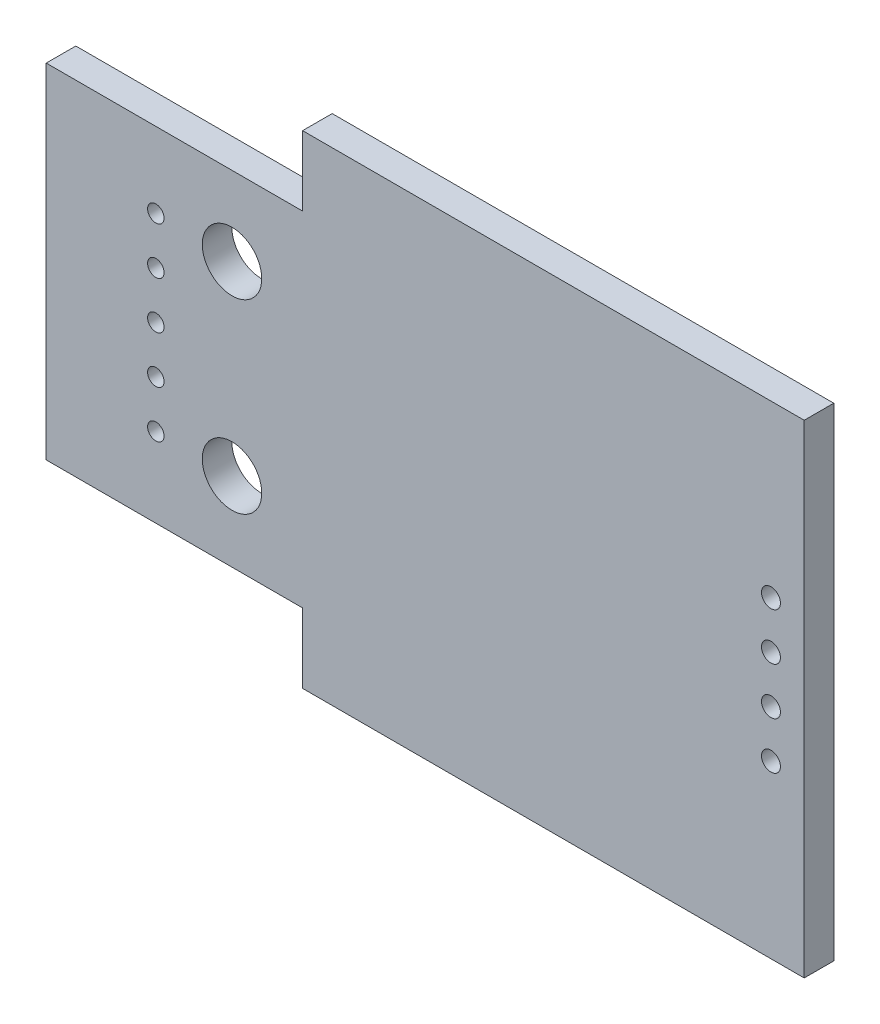
ISO-10303-21;
HEADER;
FILE_DESCRIPTION(('STEP AP214'),'2;1');
FILE_NAME('part.step','',(''),(''),'','','');
FILE_SCHEMA(('AUTOMOTIVE_DESIGN { 1 0 10303 214 1 1 1 1 }'));
ENDSEC;
DATA;
#1=APPLICATION_CONTEXT('core data for automotive mechanical design processes');
#2=APPLICATION_PROTOCOL_DEFINITION('international standard','automotive_design',2000,#1);
#3=PRODUCT_CONTEXT('',#1,'mechanical');
#4=PRODUCT('Part','Part','',(#3));
#5=PRODUCT_RELATED_PRODUCT_CATEGORY('part','',(#4));
#6=PRODUCT_DEFINITION_FORMATION('','',#4);
#7=PRODUCT_DEFINITION_CONTEXT('part definition',#1,'design');
#8=PRODUCT_DEFINITION('design','',#6,#7);
#9=PRODUCT_DEFINITION_SHAPE('','',#8);
#10=(LENGTH_UNIT() NAMED_UNIT(*) SI_UNIT(.MILLI.,.METRE.));
#11=(NAMED_UNIT(*) PLANE_ANGLE_UNIT() SI_UNIT($,.RADIAN.));
#12=(NAMED_UNIT(*) SI_UNIT($,.STERADIAN.) SOLID_ANGLE_UNIT());
#13=UNCERTAINTY_MEASURE_WITH_UNIT(LENGTH_MEASURE(1.E-05),#10,'distance_accuracy_value','');
#14=(GEOMETRIC_REPRESENTATION_CONTEXT(3) GLOBAL_UNCERTAINTY_ASSIGNED_CONTEXT((#13)) GLOBAL_UNIT_ASSIGNED_CONTEXT((#10,
#11,#12)) REPRESENTATION_CONTEXT('',''));
#15=CARTESIAN_POINT('',(0.,0.,0.));
#16=DIRECTION('',(0.,0.,1.));
#17=DIRECTION('',(1.,0.,0.));
#18=AXIS2_PLACEMENT_3D('',#15,#16,#17);
#19=CARTESIAN_POINT('',(9.199999809265,4.75,1.59143954));
#20=DIRECTION('',(0.,0.,1.));
#21=DIRECTION('',(1.,0.,0.));
#22=AXIS2_PLACEMENT_3D('',#19,#20,#21);
#23=PLANE('',#22);
#24=CARTESIAN_POINT('',(48.20984008,17.83400294,1.59143954));
#25=DIRECTION('',(0.,0.,1.));
#26=DIRECTION('',(1.,0.,0.));
#27=AXIS2_PLACEMENT_3D('',#24,#25,#26);
#28=CIRCLE('',#27,0.50999898);
#29=CARTESIAN_POINT('',(48.71983906,17.83400294,1.59143954));
#30=VERTEX_POINT('',#29);
#31=EDGE_CURVE('E27',#30,#30,#28,.T.);
#32=ORIENTED_EDGE('',*,*,#31,.F.);
#33=EDGE_LOOP('',(#32));
#34=FACE_BOUND('',#33,.T.);
#35=CARTESIAN_POINT('',(48.20984008,15.29400294,1.59143954));
#36=DIRECTION('',(0.,0.,1.));
#37=DIRECTION('',(1.,0.,0.));
#38=AXIS2_PLACEMENT_3D('',#35,#36,#37);
#39=CIRCLE('',#38,0.50999898);
#40=CARTESIAN_POINT('',(48.71983906,15.29400294,1.59143954));
#41=VERTEX_POINT('',#40);
#42=EDGE_CURVE('E275',#41,#41,#39,.T.);
#43=ORIENTED_EDGE('',*,*,#42,.F.);
#44=EDGE_LOOP('',(#43));
#45=FACE_BOUND('',#44,.T.);
#46=CARTESIAN_POINT('',(19.1999997,19.0000001,1.59143954));
#47=DIRECTION('',(0.,0.,1.));
#48=DIRECTION('',(1.,0.,0.));
#49=AXIS2_PLACEMENT_3D('',#46,#47,#48);
#50=CIRCLE('',#49,1.59999934);
#51=CARTESIAN_POINT('',(20.79999904,19.0000001,1.59143954));
#52=VERTEX_POINT('',#51);
#53=EDGE_CURVE('E240',#52,#52,#50,.T.);
#54=ORIENTED_EDGE('',*,*,#53,.F.);
#55=EDGE_LOOP('',(#54));
#56=FACE_BOUND('',#55,.T.);
#57=CARTESIAN_POINT('',(48.20984008,12.75400294,1.59143954));
#58=DIRECTION('',(0.,0.,1.));
#59=DIRECTION('',(1.,0.,0.));
#60=AXIS2_PLACEMENT_3D('',#57,#58,#59);
#61=CIRCLE('',#60,0.50999898);
#62=CARTESIAN_POINT('',(48.71983906,12.75400294,1.59143954));
#63=VERTEX_POINT('',#62);
#64=EDGE_CURVE('E271',#63,#63,#61,.T.);
#65=ORIENTED_EDGE('',*,*,#64,.F.);
#66=EDGE_LOOP('',(#65));
#67=FACE_BOUND('',#66,.T.);
#68=CARTESIAN_POINT('',(48.20984008,10.21400294,1.59143954));
#69=DIRECTION('',(0.,0.,1.));
#70=DIRECTION('',(1.,0.,0.));
#71=AXIS2_PLACEMENT_3D('',#68,#69,#70);
#72=CIRCLE('',#71,0.50999898);
#73=CARTESIAN_POINT('',(48.71983906,10.21400294,1.59143954));
#74=VERTEX_POINT('',#73);
#75=EDGE_CURVE('E303',#74,#74,#72,.T.);
#76=ORIENTED_EDGE('',*,*,#75,.F.);
#77=EDGE_LOOP('',(#76));
#78=FACE_BOUND('',#77,.T.);
#79=CARTESIAN_POINT('',(19.1999997,8.99999978,1.59143954));
#80=DIRECTION('',(0.,0.,1.));
#81=DIRECTION('',(1.,0.,0.));
#82=AXIS2_PLACEMENT_3D('',#79,#80,#81);
#83=CIRCLE('',#82,1.59999934);
#84=CARTESIAN_POINT('',(20.79999904,8.99999978,1.59143954));
#85=VERTEX_POINT('',#84);
#86=EDGE_CURVE('E264',#85,#85,#83,.T.);
#87=ORIENTED_EDGE('',*,*,#86,.F.);
#88=EDGE_LOOP('',(#87));
#89=FACE_BOUND('',#88,.T.);
#90=CARTESIAN_POINT('',(15.10000028,16.64999972,1.59143954));
#91=DIRECTION('',(0.,0.,1.));
#92=DIRECTION('',(1.,0.,0.));
#93=AXIS2_PLACEMENT_3D('',#90,#91,#92);
#94=CIRCLE('',#93,0.4445);
#95=CARTESIAN_POINT('',(15.54450028,16.64999972,1.59143954));
#96=VERTEX_POINT('',#95);
#97=EDGE_CURVE('E236',#96,#96,#94,.T.);
#98=ORIENTED_EDGE('',*,*,#97,.F.);
#99=EDGE_LOOP('',(#98));
#100=FACE_BOUND('',#99,.T.);
#101=CARTESIAN_POINT('',(15.10000028,14.10999972,1.59143954));
#102=DIRECTION('',(0.,0.,1.));
#103=DIRECTION('',(1.,0.,0.));
#104=AXIS2_PLACEMENT_3D('',#101,#102,#103);
#105=CIRCLE('',#104,0.4445);
#106=CARTESIAN_POINT('',(15.54450028,14.10999972,1.59143954));
#107=VERTEX_POINT('',#106);
#108=EDGE_CURVE('E347',#107,#107,#105,.T.);
#109=ORIENTED_EDGE('',*,*,#108,.F.);
#110=EDGE_LOOP('',(#109));
#111=FACE_BOUND('',#110,.T.);
#112=CARTESIAN_POINT('',(15.10000028,19.18999972,1.59143954));
#113=DIRECTION('',(0.,0.,1.));
#114=DIRECTION('',(1.,0.,0.));
#115=AXIS2_PLACEMENT_3D('',#112,#113,#114);
#116=CIRCLE('',#115,0.4445);
#117=CARTESIAN_POINT('',(15.54450028,19.18999972,1.59143954));
#118=VERTEX_POINT('',#117);
#119=EDGE_CURVE('E410',#118,#118,#116,.T.);
#120=ORIENTED_EDGE('',*,*,#119,.F.);
#121=EDGE_LOOP('',(#120));
#122=FACE_BOUND('',#121,.T.);
#123=CARTESIAN_POINT('',(15.10000028,9.02999972,1.59143954));
#124=DIRECTION('',(0.,0.,1.));
#125=DIRECTION('',(1.,0.,0.));
#126=AXIS2_PLACEMENT_3D('',#123,#124,#125);
#127=CIRCLE('',#126,0.4445);
#128=CARTESIAN_POINT('',(15.54450028,9.02999972,1.59143954));
#129=VERTEX_POINT('',#128);
#130=EDGE_CURVE('E280',#129,#129,#127,.T.);
#131=ORIENTED_EDGE('',*,*,#130,.F.);
#132=EDGE_LOOP('',(#131));
#133=FACE_BOUND('',#132,.T.);
#134=CARTESIAN_POINT('',(15.10000028,11.56999972,1.59143954));
#135=DIRECTION('',(0.,0.,1.));
#136=DIRECTION('',(1.,0.,0.));
#137=AXIS2_PLACEMENT_3D('',#134,#135,#136);
#138=CIRCLE('',#137,0.4445);
#139=CARTESIAN_POINT('',(15.54450028,11.56999972,1.59143954));
#140=VERTEX_POINT('',#139);
#141=EDGE_CURVE('E282',#140,#140,#138,.T.);
#142=ORIENTED_EDGE('',*,*,#141,.F.);
#143=EDGE_LOOP('',(#142));
#144=FACE_BOUND('',#143,.T.);
#145=DIRECTION('',(-1.,0.,0.));
#146=VECTOR('',#145,1.);
#147=CARTESIAN_POINT('',(23.,4.75,1.59143954));
#148=LINE('',#147,#146);
#149=CARTESIAN_POINT('',(23.,4.75,1.59143954));
#150=VERTEX_POINT('',#149);
#151=CARTESIAN_POINT('',(9.199999809265,4.75,1.59143954));
#152=VERTEX_POINT('',#151);
#153=EDGE_CURVE('E108',#150,#152,#148,.T.);
#154=ORIENTED_EDGE('',*,*,#153,.F.);
#155=DIRECTION('',(0.,1.,0.));
#156=VECTOR('',#155,1.);
#157=CARTESIAN_POINT('',(23.,1.,1.59143954));
#158=LINE('',#157,#156);
#159=CARTESIAN_POINT('',(23.,1.,1.59143954));
#160=VERTEX_POINT('',#159);
#161=EDGE_CURVE('E198',#160,#150,#158,.T.);
#162=ORIENTED_EDGE('',*,*,#161,.F.);
#163=DIRECTION('',(-1.,0.,0.));
#164=VECTOR('',#163,1.);
#165=CARTESIAN_POINT('',(50.,1.,1.59143954));
#166=LINE('',#165,#164);
#167=CARTESIAN_POINT('',(50.,1.,1.59143954));
#168=VERTEX_POINT('',#167);
#169=EDGE_CURVE('E191',#168,#160,#166,.T.);
#170=ORIENTED_EDGE('',*,*,#169,.F.);
#171=DIRECTION('',(0.,-1.,0.));
#172=VECTOR('',#171,1.);
#173=CARTESIAN_POINT('',(50.,27.,1.59143954));
#174=LINE('',#173,#172);
#175=CARTESIAN_POINT('',(50.,27.,1.59143954));
#176=VERTEX_POINT('',#175);
#177=EDGE_CURVE('E195',#176,#168,#174,.T.);
#178=ORIENTED_EDGE('',*,*,#177,.F.);
#179=DIRECTION('',(1.,0.,0.));
#180=VECTOR('',#179,1.);
#181=CARTESIAN_POINT('',(23.,27.,1.59143954));
#182=LINE('',#181,#180);
#183=CARTESIAN_POINT('',(23.,27.,1.59143954));
#184=VERTEX_POINT('',#183);
#185=EDGE_CURVE('E259',#184,#176,#182,.T.);
#186=ORIENTED_EDGE('',*,*,#185,.F.);
#187=DIRECTION('',(0.,1.,0.));
#188=VECTOR('',#187,1.);
#189=CARTESIAN_POINT('',(23.,23.25,1.59143954));
#190=LINE('',#189,#188);
#191=CARTESIAN_POINT('',(23.,23.25,1.59143954));
#192=VERTEX_POINT('',#191);
#193=EDGE_CURVE('E289',#192,#184,#190,.T.);
#194=ORIENTED_EDGE('',*,*,#193,.F.);
#195=DIRECTION('',(1.,0.,0.));
#196=VECTOR('',#195,1.);
#197=CARTESIAN_POINT('',(9.199999809265,23.25,1.59143954));
#198=LINE('',#197,#196);
#199=CARTESIAN_POINT('',(9.199999809265,23.25,1.59143954));
#200=VERTEX_POINT('',#199);
#201=EDGE_CURVE('E359',#200,#192,#198,.T.);
#202=ORIENTED_EDGE('',*,*,#201,.F.);
#203=DIRECTION('',(0.,1.,0.));
#204=VECTOR('',#203,1.);
#205=CARTESIAN_POINT('',(9.199999809265,4.75,1.59143954));
#206=LINE('',#205,#204);
#207=EDGE_CURVE('E252',#152,#200,#206,.T.);
#208=ORIENTED_EDGE('',*,*,#207,.F.);
#209=EDGE_LOOP('',(#154,#162,#170,#178,#186,#194,#202,#208));
#210=FACE_BOUND('',#209,.T.);
#211=ADVANCED_FACE('F16',(#34,#45,#56,#67,#78,#89,#100,#111,#122,#133,#144,#210),#23,.T.);
#212=CARTESIAN_POINT('',(9.199999809265,4.75,0.));
#213=DIRECTION('',(0.,0.,1.));
#214=DIRECTION('',(1.,0.,0.));
#215=AXIS2_PLACEMENT_3D('',#212,#213,#214);
#216=PLANE('',#215);
#217=CARTESIAN_POINT('',(48.20984008,17.83400294,0.));
#218=DIRECTION('',(0.,0.,1.));
#219=DIRECTION('',(1.,0.,0.));
#220=AXIS2_PLACEMENT_3D('',#217,#218,#219);
#221=CIRCLE('',#220,0.50999898);
#222=CARTESIAN_POINT('',(48.71983906,17.83400294,0.));
#223=VERTEX_POINT('',#222);
#224=EDGE_CURVE('E11',#223,#223,#221,.T.);
#225=ORIENTED_EDGE('',*,*,#224,.T.);
#226=EDGE_LOOP('',(#225));
#227=FACE_BOUND('',#226,.T.);
#228=CARTESIAN_POINT('',(48.20984008,15.29400294,0.));
#229=DIRECTION('',(0.,0.,1.));
#230=DIRECTION('',(1.,0.,0.));
#231=AXIS2_PLACEMENT_3D('',#228,#229,#230);
#232=CIRCLE('',#231,0.50999898);
#233=CARTESIAN_POINT('',(48.71983906,15.29400294,0.));
#234=VERTEX_POINT('',#233);
#235=EDGE_CURVE('E311',#234,#234,#232,.T.);
#236=ORIENTED_EDGE('',*,*,#235,.T.);
#237=EDGE_LOOP('',(#236));
#238=FACE_BOUND('',#237,.T.);
#239=CARTESIAN_POINT('',(19.1999997,19.0000001,0.));
#240=DIRECTION('',(0.,0.,1.));
#241=DIRECTION('',(1.,0.,0.));
#242=AXIS2_PLACEMENT_3D('',#239,#240,#241);
#243=CIRCLE('',#242,1.59999934);
#244=CARTESIAN_POINT('',(20.79999904,19.0000001,0.));
#245=VERTEX_POINT('',#244);
#246=EDGE_CURVE('E243',#245,#245,#243,.T.);
#247=ORIENTED_EDGE('',*,*,#246,.T.);
#248=EDGE_LOOP('',(#247));
#249=FACE_BOUND('',#248,.T.);
#250=CARTESIAN_POINT('',(48.20984008,12.75400294,0.));
#251=DIRECTION('',(0.,0.,1.));
#252=DIRECTION('',(1.,0.,0.));
#253=AXIS2_PLACEMENT_3D('',#250,#251,#252);
#254=CIRCLE('',#253,0.50999898);
#255=CARTESIAN_POINT('',(48.71983906,12.75400294,0.));
#256=VERTEX_POINT('',#255);
#257=EDGE_CURVE('E268',#256,#256,#254,.T.);
#258=ORIENTED_EDGE('',*,*,#257,.T.);
#259=EDGE_LOOP('',(#258));
#260=FACE_BOUND('',#259,.T.);
#261=CARTESIAN_POINT('',(48.20984008,10.21400294,0.));
#262=DIRECTION('',(0.,0.,1.));
#263=DIRECTION('',(1.,0.,0.));
#264=AXIS2_PLACEMENT_3D('',#261,#262,#263);
#265=CIRCLE('',#264,0.50999898);
#266=CARTESIAN_POINT('',(48.71983906,10.21400294,0.));
#267=VERTEX_POINT('',#266);
#268=EDGE_CURVE('E343',#267,#267,#265,.T.);
#269=ORIENTED_EDGE('',*,*,#268,.T.);
#270=EDGE_LOOP('',(#269));
#271=FACE_BOUND('',#270,.T.);
#272=CARTESIAN_POINT('',(19.1999997,8.99999978,0.));
#273=DIRECTION('',(0.,0.,1.));
#274=DIRECTION('',(1.,0.,0.));
#275=AXIS2_PLACEMENT_3D('',#272,#273,#274);
#276=CIRCLE('',#275,1.59999934);
#277=CARTESIAN_POINT('',(20.79999904,8.99999978,0.));
#278=VERTEX_POINT('',#277);
#279=EDGE_CURVE('E267',#278,#278,#276,.T.);
#280=ORIENTED_EDGE('',*,*,#279,.T.);
#281=EDGE_LOOP('',(#280));
#282=FACE_BOUND('',#281,.T.);
#283=CARTESIAN_POINT('',(15.10000028,16.64999972,0.));
#284=DIRECTION('',(0.,0.,1.));
#285=DIRECTION('',(1.,0.,0.));
#286=AXIS2_PLACEMENT_3D('',#283,#284,#285);
#287=CIRCLE('',#286,0.4445);
#288=CARTESIAN_POINT('',(15.54450028,16.64999972,0.));
#289=VERTEX_POINT('',#288);
#290=EDGE_CURVE('E232',#289,#289,#287,.T.);
#291=ORIENTED_EDGE('',*,*,#290,.T.);
#292=EDGE_LOOP('',(#291));
#293=FACE_BOUND('',#292,.T.);
#294=CARTESIAN_POINT('',(15.10000028,14.10999972,0.));
#295=DIRECTION('',(0.,0.,1.));
#296=DIRECTION('',(1.,0.,0.));
#297=AXIS2_PLACEMENT_3D('',#294,#295,#296);
#298=CIRCLE('',#297,0.4445);
#299=CARTESIAN_POINT('',(15.54450028,14.10999972,0.));
#300=VERTEX_POINT('',#299);
#301=EDGE_CURVE('E344',#300,#300,#298,.T.);
#302=ORIENTED_EDGE('',*,*,#301,.T.);
#303=EDGE_LOOP('',(#302));
#304=FACE_BOUND('',#303,.T.);
#305=CARTESIAN_POINT('',(15.10000028,19.18999972,0.));
#306=DIRECTION('',(0.,0.,1.));
#307=DIRECTION('',(1.,0.,0.));
#308=AXIS2_PLACEMENT_3D('',#305,#306,#307);
#309=CIRCLE('',#308,0.4445);
#310=CARTESIAN_POINT('',(15.54450028,19.18999972,0.));
#311=VERTEX_POINT('',#310);
#312=EDGE_CURVE('E352',#311,#311,#309,.T.);
#313=ORIENTED_EDGE('',*,*,#312,.T.);
#314=EDGE_LOOP('',(#313));
#315=FACE_BOUND('',#314,.T.);
#316=CARTESIAN_POINT('',(15.10000028,9.02999972,0.));
#317=DIRECTION('',(0.,0.,1.));
#318=DIRECTION('',(1.,0.,0.));
#319=AXIS2_PLACEMENT_3D('',#316,#317,#318);
#320=CIRCLE('',#319,0.4445);
#321=CARTESIAN_POINT('',(15.54450028,9.02999972,0.));
#322=VERTEX_POINT('',#321);
#323=EDGE_CURVE('E319',#322,#322,#320,.T.);
#324=ORIENTED_EDGE('',*,*,#323,.T.);
#325=EDGE_LOOP('',(#324));
#326=FACE_BOUND('',#325,.T.);
#327=CARTESIAN_POINT('',(15.10000028,11.56999972,0.));
#328=DIRECTION('',(0.,0.,1.));
#329=DIRECTION('',(1.,0.,0.));
#330=AXIS2_PLACEMENT_3D('',#327,#328,#329);
#331=CIRCLE('',#330,0.4445);
#332=CARTESIAN_POINT('',(15.54450028,11.56999972,0.));
#333=VERTEX_POINT('',#332);
#334=EDGE_CURVE('E281',#333,#333,#331,.T.);
#335=ORIENTED_EDGE('',*,*,#334,.T.);
#336=EDGE_LOOP('',(#335));
#337=FACE_BOUND('',#336,.T.);
#338=DIRECTION('',(0.,1.,0.));
#339=VECTOR('',#338,1.);
#340=CARTESIAN_POINT('',(9.199999809265,4.75,0.));
#341=LINE('',#340,#339);
#342=CARTESIAN_POINT('',(9.199999809265,4.75,0.));
#343=VERTEX_POINT('',#342);
#344=CARTESIAN_POINT('',(9.199999809265,23.25,0.));
#345=VERTEX_POINT('',#344);
#346=EDGE_CURVE('E330',#343,#345,#341,.T.);
#347=ORIENTED_EDGE('',*,*,#346,.T.);
#348=DIRECTION('',(1.,0.,0.));
#349=VECTOR('',#348,1.);
#350=CARTESIAN_POINT('',(9.199999809265,23.25,0.));
#351=LINE('',#350,#349);
#352=CARTESIAN_POINT('',(23.,23.25,0.));
#353=VERTEX_POINT('',#352);
#354=EDGE_CURVE('E285',#345,#353,#351,.T.);
#355=ORIENTED_EDGE('',*,*,#354,.T.);
#356=DIRECTION('',(0.,1.,0.));
#357=VECTOR('',#356,1.);
#358=CARTESIAN_POINT('',(23.,23.25,0.));
#359=LINE('',#358,#357);
#360=CARTESIAN_POINT('',(23.,27.,0.));
#361=VERTEX_POINT('',#360);
#362=EDGE_CURVE('E256',#353,#361,#359,.T.);
#363=ORIENTED_EDGE('',*,*,#362,.T.);
#364=DIRECTION('',(1.,0.,0.));
#365=VECTOR('',#364,1.);
#366=CARTESIAN_POINT('',(23.,27.,0.));
#367=LINE('',#366,#365);
#368=CARTESIAN_POINT('',(50.,27.,0.));
#369=VERTEX_POINT('',#368);
#370=EDGE_CURVE('E220',#361,#369,#367,.T.);
#371=ORIENTED_EDGE('',*,*,#370,.T.);
#372=DIRECTION('',(0.,-1.,0.));
#373=VECTOR('',#372,1.);
#374=CARTESIAN_POINT('',(50.,27.,0.));
#375=LINE('',#374,#373);
#376=CARTESIAN_POINT('',(50.,1.,0.));
#377=VERTEX_POINT('',#376);
#378=EDGE_CURVE('E204',#369,#377,#375,.T.);
#379=ORIENTED_EDGE('',*,*,#378,.T.);
#380=DIRECTION('',(-1.,0.,0.));
#381=VECTOR('',#380,1.);
#382=CARTESIAN_POINT('',(50.,1.,0.));
#383=LINE('',#382,#381);
#384=CARTESIAN_POINT('',(23.,1.,0.));
#385=VERTEX_POINT('',#384);
#386=EDGE_CURVE('E210',#377,#385,#383,.T.);
#387=ORIENTED_EDGE('',*,*,#386,.T.);
#388=DIRECTION('',(0.,1.,0.));
#389=VECTOR('',#388,1.);
#390=CARTESIAN_POINT('',(23.,1.,0.));
#391=LINE('',#390,#389);
#392=CARTESIAN_POINT('',(23.,4.75,0.));
#393=VERTEX_POINT('',#392);
#394=EDGE_CURVE('E239',#385,#393,#391,.T.);
#395=ORIENTED_EDGE('',*,*,#394,.T.);
#396=DIRECTION('',(-1.,0.,0.));
#397=VECTOR('',#396,1.);
#398=CARTESIAN_POINT('',(23.,4.75,0.));
#399=LINE('',#398,#397);
#400=EDGE_CURVE('E93',#393,#343,#399,.T.);
#401=ORIENTED_EDGE('',*,*,#400,.T.);
#402=EDGE_LOOP('',(#347,#355,#363,#371,#379,#387,#395,#401));
#403=FACE_BOUND('',#402,.T.);
#404=ADVANCED_FACE('F383',(#227,#238,#249,#260,#271,#282,#293,#304,#315,#326,#337,#403),#216,.F.);
#405=CARTESIAN_POINT('',(48.20984008,17.83400294,0.));
#406=DIRECTION('',(0.,0.,-1.));
#407=DIRECTION('',(1.,0.,0.));
#408=AXIS2_PLACEMENT_3D('',#405,#406,#407);
#409=CYLINDRICAL_SURFACE('',#408,0.50999898);
#410=DIRECTION('',(0.,0.,1.));
#411=VECTOR('',#410,1.);
#412=CARTESIAN_POINT('',(48.71983906,17.83400294,0.));
#413=LINE('',#412,#411);
#414=EDGE_CURVE('E247',#223,#30,#413,.T.);
#415=ORIENTED_EDGE('',*,*,#414,.T.);
#416=ORIENTED_EDGE('',*,*,#31,.T.);
#417=ORIENTED_EDGE('',*,*,#414,.F.);
#418=ORIENTED_EDGE('',*,*,#224,.F.);
#419=EDGE_LOOP('',(#415,#416,#417,#418));
#420=FACE_BOUND('',#419,.T.);
#421=ADVANCED_FACE('F597',(#420),#409,.F.);
#422=CARTESIAN_POINT('',(48.20984008,15.29400294,0.));
#423=DIRECTION('',(0.,0.,-1.));
#424=DIRECTION('',(1.,0.,0.));
#425=AXIS2_PLACEMENT_3D('',#422,#423,#424);
#426=CYLINDRICAL_SURFACE('',#425,0.50999898);
#427=DIRECTION('',(0.,0.,1.));
#428=VECTOR('',#427,1.);
#429=CARTESIAN_POINT('',(48.71983906,15.29400294,0.));
#430=LINE('',#429,#428);
#431=EDGE_CURVE('E255',#234,#41,#430,.T.);
#432=ORIENTED_EDGE('',*,*,#431,.T.);
#433=ORIENTED_EDGE('',*,*,#42,.T.);
#434=ORIENTED_EDGE('',*,*,#431,.F.);
#435=ORIENTED_EDGE('',*,*,#235,.F.);
#436=EDGE_LOOP('',(#432,#433,#434,#435));
#437=FACE_BOUND('',#436,.T.);
#438=ADVANCED_FACE('F387',(#437),#426,.F.);
#439=CARTESIAN_POINT('',(19.1999997,19.0000001,0.));
#440=DIRECTION('',(0.,0.,-1.));
#441=DIRECTION('',(1.,0.,0.));
#442=AXIS2_PLACEMENT_3D('',#439,#440,#441);
#443=CYLINDRICAL_SURFACE('',#442,1.59999934);
#444=DIRECTION('',(0.,0.,1.));
#445=VECTOR('',#444,1.);
#446=CARTESIAN_POINT('',(20.79999904,19.0000001,0.));
#447=LINE('',#446,#445);
#448=EDGE_CURVE('E244',#245,#52,#447,.T.);
#449=ORIENTED_EDGE('',*,*,#448,.T.);
#450=ORIENTED_EDGE('',*,*,#53,.T.);
#451=ORIENTED_EDGE('',*,*,#448,.F.);
#452=ORIENTED_EDGE('',*,*,#246,.F.);
#453=EDGE_LOOP('',(#449,#450,#451,#452));
#454=FACE_BOUND('',#453,.T.);
#455=ADVANCED_FACE('F605',(#454),#443,.F.);
#456=CARTESIAN_POINT('',(48.20984008,12.75400294,0.));
#457=DIRECTION('',(0.,0.,-1.));
#458=DIRECTION('',(1.,0.,0.));
#459=AXIS2_PLACEMENT_3D('',#456,#457,#458);
#460=CYLINDRICAL_SURFACE('',#459,0.50999898);
#461=DIRECTION('',(0.,0.,1.));
#462=VECTOR('',#461,1.);
#463=CARTESIAN_POINT('',(48.71983906,12.75400294,0.));
#464=LINE('',#463,#462);
#465=EDGE_CURVE('E308',#256,#63,#464,.T.);
#466=ORIENTED_EDGE('',*,*,#465,.T.);
#467=ORIENTED_EDGE('',*,*,#64,.T.);
#468=ORIENTED_EDGE('',*,*,#465,.F.);
#469=ORIENTED_EDGE('',*,*,#257,.F.);
#470=EDGE_LOOP('',(#466,#467,#468,#469));
#471=FACE_BOUND('',#470,.T.);
#472=ADVANCED_FACE('F594',(#471),#460,.F.);
#473=CARTESIAN_POINT('',(48.20984008,10.21400294,0.));
#474=DIRECTION('',(0.,0.,-1.));
#475=DIRECTION('',(1.,0.,0.));
#476=AXIS2_PLACEMENT_3D('',#473,#474,#475);
#477=CYLINDRICAL_SURFACE('',#476,0.50999898);
#478=DIRECTION('',(0.,0.,1.));
#479=VECTOR('',#478,1.);
#480=CARTESIAN_POINT('',(48.71983906,10.21400294,0.));
#481=LINE('',#480,#479);
#482=EDGE_CURVE('E299',#267,#74,#481,.T.);
#483=ORIENTED_EDGE('',*,*,#482,.T.);
#484=ORIENTED_EDGE('',*,*,#75,.T.);
#485=ORIENTED_EDGE('',*,*,#482,.F.);
#486=ORIENTED_EDGE('',*,*,#268,.F.);
#487=EDGE_LOOP('',(#483,#484,#485,#486));
#488=FACE_BOUND('',#487,.T.);
#489=ADVANCED_FACE('F18',(#488),#477,.F.);
#490=CARTESIAN_POINT('',(19.1999997,8.99999978,0.));
#491=DIRECTION('',(0.,0.,-1.));
#492=DIRECTION('',(1.,0.,0.));
#493=AXIS2_PLACEMENT_3D('',#490,#491,#492);
#494=CYLINDRICAL_SURFACE('',#493,1.59999934);
#495=DIRECTION('',(0.,0.,1.));
#496=VECTOR('',#495,1.);
#497=CARTESIAN_POINT('',(20.79999904,8.99999978,0.));
#498=LINE('',#497,#496);
#499=EDGE_CURVE('E235',#278,#85,#498,.T.);
#500=ORIENTED_EDGE('',*,*,#499,.T.);
#501=ORIENTED_EDGE('',*,*,#86,.T.);
#502=ORIENTED_EDGE('',*,*,#499,.F.);
#503=ORIENTED_EDGE('',*,*,#279,.F.);
#504=EDGE_LOOP('',(#500,#501,#502,#503));
#505=FACE_BOUND('',#504,.T.);
#506=ADVANCED_FACE('F582',(#505),#494,.F.);
#507=CARTESIAN_POINT('',(15.10000028,16.64999972,0.));
#508=DIRECTION('',(0.,0.,-1.));
#509=DIRECTION('',(1.,0.,0.));
#510=AXIS2_PLACEMENT_3D('',#507,#508,#509);
#511=CYLINDRICAL_SURFACE('',#510,0.4445);
#512=DIRECTION('',(0.,0.,1.));
#513=VECTOR('',#512,1.);
#514=CARTESIAN_POINT('',(15.54450028,16.64999972,0.));
#515=LINE('',#514,#513);
#516=EDGE_CURVE('E230',#289,#96,#515,.T.);
#517=ORIENTED_EDGE('',*,*,#516,.T.);
#518=ORIENTED_EDGE('',*,*,#97,.T.);
#519=ORIENTED_EDGE('',*,*,#516,.F.);
#520=ORIENTED_EDGE('',*,*,#290,.F.);
#521=EDGE_LOOP('',(#517,#518,#519,#520));
#522=FACE_BOUND('',#521,.T.);
#523=ADVANCED_FACE('F584',(#522),#511,.F.);
#524=CARTESIAN_POINT('',(15.10000028,14.10999972,0.));
#525=DIRECTION('',(0.,0.,-1.));
#526=DIRECTION('',(1.,0.,0.));
#527=AXIS2_PLACEMENT_3D('',#524,#525,#526);
#528=CYLINDRICAL_SURFACE('',#527,0.4445);
#529=DIRECTION('',(0.,0.,1.));
#530=VECTOR('',#529,1.);
#531=CARTESIAN_POINT('',(15.54450028,14.10999972,0.));
#532=LINE('',#531,#530);
#533=EDGE_CURVE('E348',#300,#107,#532,.T.);
#534=ORIENTED_EDGE('',*,*,#533,.T.);
#535=ORIENTED_EDGE('',*,*,#108,.T.);
#536=ORIENTED_EDGE('',*,*,#533,.F.);
#537=ORIENTED_EDGE('',*,*,#301,.F.);
#538=EDGE_LOOP('',(#534,#535,#536,#537));
#539=FACE_BOUND('',#538,.T.);
#540=ADVANCED_FACE('F591',(#539),#528,.F.);
#541=CARTESIAN_POINT('',(15.10000028,19.18999972,0.));
#542=DIRECTION('',(0.,0.,-1.));
#543=DIRECTION('',(1.,0.,0.));
#544=AXIS2_PLACEMENT_3D('',#541,#542,#543);
#545=CYLINDRICAL_SURFACE('',#544,0.4445);
#546=DIRECTION('',(0.,0.,1.));
#547=VECTOR('',#546,1.);
#548=CARTESIAN_POINT('',(15.54450028,19.18999972,0.));
#549=LINE('',#548,#547);
#550=EDGE_CURVE('E322',#311,#118,#549,.T.);
#551=ORIENTED_EDGE('',*,*,#550,.T.);
#552=ORIENTED_EDGE('',*,*,#119,.T.);
#553=ORIENTED_EDGE('',*,*,#550,.F.);
#554=ORIENTED_EDGE('',*,*,#312,.F.);
#555=EDGE_LOOP('',(#551,#552,#553,#554));
#556=FACE_BOUND('',#555,.T.);
#557=ADVANCED_FACE('F600',(#556),#545,.F.);
#558=CARTESIAN_POINT('',(15.10000028,9.02999972,0.));
#559=DIRECTION('',(0.,0.,-1.));
#560=DIRECTION('',(1.,0.,0.));
#561=AXIS2_PLACEMENT_3D('',#558,#559,#560);
#562=CYLINDRICAL_SURFACE('',#561,0.4445);
#563=DIRECTION('',(0.,0.,1.));
#564=VECTOR('',#563,1.);
#565=CARTESIAN_POINT('',(15.54450028,9.02999972,0.));
#566=LINE('',#565,#564);
#567=EDGE_CURVE('E276',#322,#129,#566,.T.);
#568=ORIENTED_EDGE('',*,*,#567,.T.);
#569=ORIENTED_EDGE('',*,*,#130,.T.);
#570=ORIENTED_EDGE('',*,*,#567,.F.);
#571=ORIENTED_EDGE('',*,*,#323,.F.);
#572=EDGE_LOOP('',(#568,#569,#570,#571));
#573=FACE_BOUND('',#572,.T.);
#574=ADVANCED_FACE('F603',(#573),#562,.F.);
#575=CARTESIAN_POINT('',(15.10000028,11.56999972,0.));
#576=DIRECTION('',(0.,0.,-1.));
#577=DIRECTION('',(1.,0.,0.));
#578=AXIS2_PLACEMENT_3D('',#575,#576,#577);
#579=CYLINDRICAL_SURFACE('',#578,0.4445);
#580=DIRECTION('',(0.,0.,1.));
#581=VECTOR('',#580,1.);
#582=CARTESIAN_POINT('',(15.54450028,11.56999972,0.));
#583=LINE('',#582,#581);
#584=EDGE_CURVE('E20',#333,#140,#583,.T.);
#585=ORIENTED_EDGE('',*,*,#584,.T.);
#586=ORIENTED_EDGE('',*,*,#141,.T.);
#587=ORIENTED_EDGE('',*,*,#584,.F.);
#588=ORIENTED_EDGE('',*,*,#334,.F.);
#589=EDGE_LOOP('',(#585,#586,#587,#588));
#590=FACE_BOUND('',#589,.T.);
#591=ADVANCED_FACE('F419',(#590),#579,.F.);
#592=CARTESIAN_POINT('',(23.,4.75,0.));
#593=DIRECTION('',(0.,-1.,0.));
#594=DIRECTION('',(0.,0.,-1.));
#595=AXIS2_PLACEMENT_3D('',#592,#593,#594);
#596=PLANE('',#595);
#597=DIRECTION('',(0.,0.,1.));
#598=VECTOR('',#597,1.);
#599=CARTESIAN_POINT('',(23.,4.75,0.));
#600=LINE('',#599,#598);
#601=EDGE_CURVE('E293',#393,#150,#600,.T.);
#602=ORIENTED_EDGE('',*,*,#601,.T.);
#603=ORIENTED_EDGE('',*,*,#153,.T.);
#604=DIRECTION('',(0.,0.,1.));
#605=VECTOR('',#604,1.);
#606=CARTESIAN_POINT('',(9.199999809265,4.75,0.));
#607=LINE('',#606,#605);
#608=EDGE_CURVE('E248',#343,#152,#607,.T.);
#609=ORIENTED_EDGE('',*,*,#608,.F.);
#610=ORIENTED_EDGE('',*,*,#400,.F.);
#611=EDGE_LOOP('',(#602,#603,#609,#610));
#612=FACE_BOUND('',#611,.T.);
#613=ADVANCED_FACE('F616',(#612),#596,.T.);
#614=CARTESIAN_POINT('',(23.,1.,0.));
#615=DIRECTION('',(-1.,0.,0.));
#616=DIRECTION('',(0.,0.,1.));
#617=AXIS2_PLACEMENT_3D('',#614,#615,#616);
#618=PLANE('',#617);
#619=DIRECTION('',(0.,0.,1.));
#620=VECTOR('',#619,1.);
#621=CARTESIAN_POINT('',(23.,1.,0.));
#622=LINE('',#621,#620);
#623=EDGE_CURVE('E203',#385,#160,#622,.T.);
#624=ORIENTED_EDGE('',*,*,#623,.T.);
#625=ORIENTED_EDGE('',*,*,#161,.T.);
#626=ORIENTED_EDGE('',*,*,#601,.F.);
#627=ORIENTED_EDGE('',*,*,#394,.F.);
#628=EDGE_LOOP('',(#624,#625,#626,#627));
#629=FACE_BOUND('',#628,.T.);
#630=ADVANCED_FACE('F609',(#629),#618,.T.);
#631=CARTESIAN_POINT('',(50.,1.,0.));
#632=DIRECTION('',(0.,-1.,0.));
#633=DIRECTION('',(0.,0.,-1.));
#634=AXIS2_PLACEMENT_3D('',#631,#632,#633);
#635=PLANE('',#634);
#636=DIRECTION('',(0.,0.,1.));
#637=VECTOR('',#636,1.);
#638=CARTESIAN_POINT('',(50.,1.,0.));
#639=LINE('',#638,#637);
#640=EDGE_CURVE('E207',#377,#168,#639,.T.);
#641=ORIENTED_EDGE('',*,*,#640,.T.);
#642=ORIENTED_EDGE('',*,*,#169,.T.);
#643=ORIENTED_EDGE('',*,*,#623,.F.);
#644=ORIENTED_EDGE('',*,*,#386,.F.);
#645=EDGE_LOOP('',(#641,#642,#643,#644));
#646=FACE_BOUND('',#645,.T.);
#647=ADVANCED_FACE('F208',(#646),#635,.T.);
#648=CARTESIAN_POINT('',(50.,27.,0.));
#649=DIRECTION('',(1.,0.,0.));
#650=DIRECTION('',(0.,1.,0.));
#651=AXIS2_PLACEMENT_3D('',#648,#649,#650);
#652=PLANE('',#651);
#653=DIRECTION('',(0.,0.,1.));
#654=VECTOR('',#653,1.);
#655=CARTESIAN_POINT('',(50.,27.,0.));
#656=LINE('',#655,#654);
#657=EDGE_CURVE('E217',#369,#176,#656,.T.);
#658=ORIENTED_EDGE('',*,*,#657,.T.);
#659=ORIENTED_EDGE('',*,*,#177,.T.);
#660=ORIENTED_EDGE('',*,*,#640,.F.);
#661=ORIENTED_EDGE('',*,*,#378,.F.);
#662=EDGE_LOOP('',(#658,#659,#660,#661));
#663=FACE_BOUND('',#662,.T.);
#664=ADVANCED_FACE('F215',(#663),#652,.T.);
#665=CARTESIAN_POINT('',(23.,27.,0.));
#666=DIRECTION('',(0.,1.,0.));
#667=DIRECTION('',(1.,0.,0.));
#668=AXIS2_PLACEMENT_3D('',#665,#666,#667);
#669=PLANE('',#668);
#670=DIRECTION('',(0.,0.,1.));
#671=VECTOR('',#670,1.);
#672=CARTESIAN_POINT('',(23.,27.,0.));
#673=LINE('',#672,#671);
#674=EDGE_CURVE('E260',#361,#184,#673,.T.);
#675=ORIENTED_EDGE('',*,*,#674,.T.);
#676=ORIENTED_EDGE('',*,*,#185,.T.);
#677=ORIENTED_EDGE('',*,*,#657,.F.);
#678=ORIENTED_EDGE('',*,*,#370,.F.);
#679=EDGE_LOOP('',(#675,#676,#677,#678));
#680=FACE_BOUND('',#679,.T.);
#681=ADVANCED_FACE('F614',(#680),#669,.T.);
#682=CARTESIAN_POINT('',(23.,23.25,0.));
#683=DIRECTION('',(-1.,0.,0.));
#684=DIRECTION('',(0.,0.,1.));
#685=AXIS2_PLACEMENT_3D('',#682,#683,#684);
#686=PLANE('',#685);
#687=DIRECTION('',(0.,0.,1.));
#688=VECTOR('',#687,1.);
#689=CARTESIAN_POINT('',(23.,23.25,0.));
#690=LINE('',#689,#688);
#691=EDGE_CURVE('E290',#353,#192,#690,.T.);
#692=ORIENTED_EDGE('',*,*,#691,.T.);
#693=ORIENTED_EDGE('',*,*,#193,.T.);
#694=ORIENTED_EDGE('',*,*,#674,.F.);
#695=ORIENTED_EDGE('',*,*,#362,.F.);
#696=EDGE_LOOP('',(#692,#693,#694,#695));
#697=FACE_BOUND('',#696,.T.);
#698=ADVANCED_FACE('F635',(#697),#686,.T.);
#699=CARTESIAN_POINT('',(9.199999809265,23.25,0.));
#700=DIRECTION('',(0.,1.,0.));
#701=DIRECTION('',(1.,0.,0.));
#702=AXIS2_PLACEMENT_3D('',#699,#700,#701);
#703=PLANE('',#702);
#704=DIRECTION('',(0.,0.,1.));
#705=VECTOR('',#704,1.);
#706=CARTESIAN_POINT('',(9.199999809265,23.25,0.));
#707=LINE('',#706,#705);
#708=EDGE_CURVE('E315',#345,#200,#707,.T.);
#709=ORIENTED_EDGE('',*,*,#708,.T.);
#710=ORIENTED_EDGE('',*,*,#201,.T.);
#711=ORIENTED_EDGE('',*,*,#691,.F.);
#712=ORIENTED_EDGE('',*,*,#354,.F.);
#713=EDGE_LOOP('',(#709,#710,#711,#712));
#714=FACE_BOUND('',#713,.T.);
#715=ADVANCED_FACE('F630',(#714),#703,.T.);
#716=CARTESIAN_POINT('',(9.199999809265,4.75,0.));
#717=DIRECTION('',(-1.,0.,0.));
#718=DIRECTION('',(0.,0.,1.));
#719=AXIS2_PLACEMENT_3D('',#716,#717,#718);
#720=PLANE('',#719);
#721=ORIENTED_EDGE('',*,*,#608,.T.);
#722=ORIENTED_EDGE('',*,*,#207,.T.);
#723=ORIENTED_EDGE('',*,*,#708,.F.);
#724=ORIENTED_EDGE('',*,*,#346,.F.);
#725=EDGE_LOOP('',(#721,#722,#723,#724));
#726=FACE_BOUND('',#725,.T.);
#727=ADVANCED_FACE('F628',(#726),#720,.T.);
#728=CLOSED_SHELL('',(#211,#404,#421,#438,#455,#472,#489,#506,#523,#540,#557,#574,#591,#613,
#630,#647,#664,#681,#698,#715,#727));
#729=MANIFOLD_SOLID_BREP('B1',#728);
#730=ADVANCED_BREP_SHAPE_REPRESENTATION('',(#18,#729),#14);
#731=SHAPE_DEFINITION_REPRESENTATION(#9,#730);
ENDSEC;
END-ISO-10303-21;
